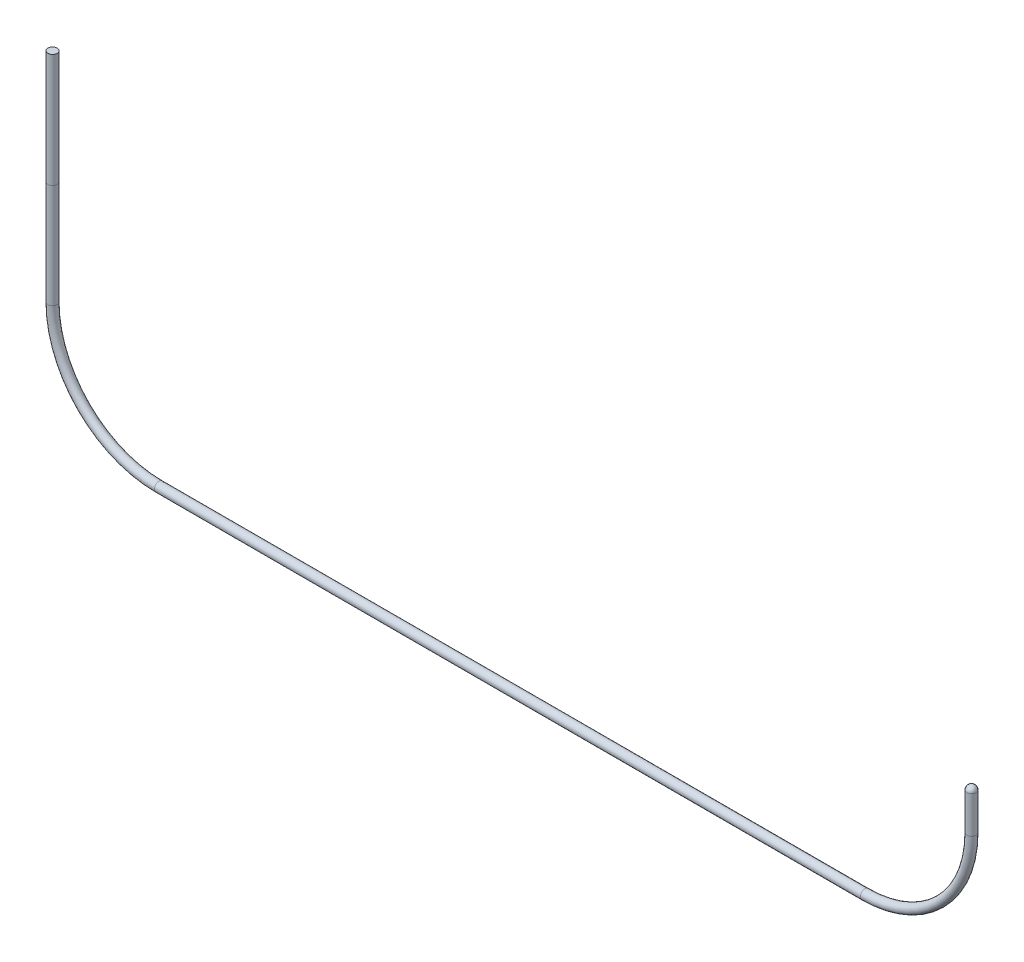
ISO-10303-21;
HEADER;
FILE_DESCRIPTION(('STEP AP214'),'2;1');
FILE_NAME('part.step','',(''),(''),'','','');
FILE_SCHEMA(('AUTOMOTIVE_DESIGN { 1 0 10303 214 1 1 1 1 }'));
ENDSEC;
DATA;
#1=APPLICATION_CONTEXT('core data for automotive mechanical design processes');
#2=APPLICATION_PROTOCOL_DEFINITION('international standard','automotive_design',2000,#1);
#3=PRODUCT_CONTEXT('',#1,'mechanical');
#4=PRODUCT('Part','Part','',(#3));
#5=PRODUCT_RELATED_PRODUCT_CATEGORY('part','',(#4));
#6=PRODUCT_DEFINITION_FORMATION('','',#4);
#7=PRODUCT_DEFINITION_CONTEXT('part definition',#1,'design');
#8=PRODUCT_DEFINITION('design','',#6,#7);
#9=PRODUCT_DEFINITION_SHAPE('','',#8);
#10=(LENGTH_UNIT() NAMED_UNIT(*) SI_UNIT(.MILLI.,.METRE.));
#11=(NAMED_UNIT(*) PLANE_ANGLE_UNIT() SI_UNIT($,.RADIAN.));
#12=(NAMED_UNIT(*) SI_UNIT($,.STERADIAN.) SOLID_ANGLE_UNIT());
#13=UNCERTAINTY_MEASURE_WITH_UNIT(LENGTH_MEASURE(1.E-05),#10,'distance_accuracy_value','');
#14=(GEOMETRIC_REPRESENTATION_CONTEXT(3) GLOBAL_UNCERTAINTY_ASSIGNED_CONTEXT((#13)) GLOBAL_UNIT_ASSIGNED_CONTEXT((#10,
#11,#12)) REPRESENTATION_CONTEXT('',''));
#15=CARTESIAN_POINT('',(0.,0.,0.));
#16=DIRECTION('',(0.,0.,1.));
#17=DIRECTION('',(1.,0.,0.));
#18=AXIS2_PLACEMENT_3D('',#15,#16,#17);
#19=CARTESIAN_POINT('',(-16.4338,-3.4925,0.));
#20=DIRECTION('',(0.,1.,0.));
#21=DIRECTION('',(0.,0.,1.));
#22=AXIS2_PLACEMENT_3D('',#19,#20,#21);
#23=CYLINDRICAL_SURFACE('',#22,0.165100000000001);
#24=CARTESIAN_POINT('',(-16.4338,-3.4925,0.));
#25=DIRECTION('',(0.,1.,0.));
#26=DIRECTION('',(0.,0.,1.));
#27=AXIS2_PLACEMENT_3D('',#24,#25,#26);
#28=CIRCLE('',#27,0.165100000000001);
#29=CARTESIAN_POINT('',(-16.5989,-3.4925,0.));
#30=VERTEX_POINT('',#29);
#31=EDGE_CURVE('E67',#30,#30,#28,.T.);
#32=ORIENTED_EDGE('',*,*,#31,.T.);
#33=EDGE_LOOP('',(#32));
#34=FACE_BOUND('',#33,.T.);
#35=CARTESIAN_POINT('',(-16.4338,0.228599999999995,0.));
#36=DIRECTION('',(0.,1.,0.));
#37=DIRECTION('',(0.,0.,1.));
#38=AXIS2_PLACEMENT_3D('',#35,#36,#37);
#39=CIRCLE('',#38,0.165100000000001);
#40=CARTESIAN_POINT('',(-16.4338,0.228599999999995,0.165100000000001));
#41=VERTEX_POINT('',#40);
#42=EDGE_CURVE('E10',#41,#41,#39,.F.);
#43=ORIENTED_EDGE('',*,*,#42,.T.);
#44=EDGE_LOOP('',(#43));
#45=FACE_BOUND('',#44,.T.);
#46=ADVANCED_FACE('F41',(#34,#45),#23,.T.);
#47=CARTESIAN_POINT('',(16.4338,-3.4925,0.));
#48=DIRECTION('',(0.,1.,0.));
#49=DIRECTION('',(0.,0.,1.));
#50=AXIS2_PLACEMENT_3D('',#47,#48,#49);
#51=CYLINDRICAL_SURFACE('',#50,0.165100000000001);
#52=CARTESIAN_POINT('',(16.4338,-2.1717,0.));
#53=DIRECTION('',(0.,1.,0.));
#54=DIRECTION('',(0.,0.,1.));
#55=AXIS2_PLACEMENT_3D('',#52,#53,#54);
#56=CIRCLE('',#55,0.165100000000001);
#57=CARTESIAN_POINT('',(16.4338,-2.1717,0.165100000000001));
#58=VERTEX_POINT('',#57);
#59=EDGE_CURVE('E49',#58,#58,#56,.F.);
#60=ORIENTED_EDGE('',*,*,#59,.T.);
#61=EDGE_LOOP('',(#60));
#62=FACE_BOUND('',#61,.T.);
#63=CARTESIAN_POINT('',(16.4338,-3.4925,0.));
#64=DIRECTION('',(0.,-1.,0.));
#65=DIRECTION('',(0.,0.,1.));
#66=AXIS2_PLACEMENT_3D('',#63,#64,#65);
#67=CIRCLE('',#66,0.165100000000001);
#68=CARTESIAN_POINT('',(16.5989,-3.4925,0.));
#69=VERTEX_POINT('',#68);
#70=EDGE_CURVE('E55',#69,#69,#67,.T.);
#71=ORIENTED_EDGE('',*,*,#70,.F.);
#72=EDGE_LOOP('',(#71));
#73=FACE_BOUND('',#72,.T.);
#74=ADVANCED_FACE('F91',(#62,#73),#51,.T.);
#75=CARTESIAN_POINT('',(12.6238,-3.4925,0.));
#76=DIRECTION('',(0.,0.,1.));
#77=DIRECTION('',(1.,0.,0.));
#78=AXIS2_PLACEMENT_3D('',#75,#76,#77);
#79=TOROIDAL_SURFACE('',#78,3.81,0.165100000000001);
#80=CARTESIAN_POINT('',(12.6238,-7.3025,0.));
#81=DIRECTION('',(-1.,0.,0.));
#82=DIRECTION('',(0.,0.,1.));
#83=AXIS2_PLACEMENT_3D('',#80,#81,#82);
#84=CIRCLE('',#83,0.165100000000001);
#85=CARTESIAN_POINT('',(12.6238,-7.4676,0.));
#86=VERTEX_POINT('',#85);
#87=EDGE_CURVE('E59',#86,#86,#84,.T.);
#88=CARTESIAN_POINT('',(12.6238,-3.4925,0.));
#89=DIRECTION('',(0.,0.,1.));
#90=DIRECTION('',(1.,0.,0.));
#91=AXIS2_PLACEMENT_3D('',#88,#89,#90);
#92=CIRCLE('',#91,3.9751);
#93=EDGE_CURVE('',#86,#69,#92,.T.);
#94=ORIENTED_EDGE('',*,*,#87,.F.);
#95=ORIENTED_EDGE('',*,*,#70,.T.);
#96=ORIENTED_EDGE('',*,*,#93,.T.);
#97=ORIENTED_EDGE('',*,*,#93,.F.);
#98=EDGE_LOOP('',(#94,#96,#95,#97));
#99=FACE_BOUND('',#98,.T.);
#100=ADVANCED_FACE('F85',(#99),#79,.T.);
#101=CARTESIAN_POINT('',(-12.6238,-7.3025,0.));
#102=DIRECTION('',(1.,0.,0.));
#103=DIRECTION('',(0.,1.,0.));
#104=AXIS2_PLACEMENT_3D('',#101,#102,#103);
#105=CYLINDRICAL_SURFACE('',#104,0.165100000000001);
#106=CARTESIAN_POINT('',(-12.6238,-7.3025,0.));
#107=DIRECTION('',(-1.,0.,0.));
#108=DIRECTION('',(0.,0.,1.));
#109=AXIS2_PLACEMENT_3D('',#106,#107,#108);
#110=CIRCLE('',#109,0.165100000000001);
#111=CARTESIAN_POINT('',(-12.6238,-7.4676,0.));
#112=VERTEX_POINT('',#111);
#113=EDGE_CURVE('E64',#112,#112,#110,.T.);
#114=ORIENTED_EDGE('',*,*,#113,.F.);
#115=EDGE_LOOP('',(#114));
#116=FACE_BOUND('',#115,.T.);
#117=ORIENTED_EDGE('',*,*,#87,.T.);
#118=EDGE_LOOP('',(#117));
#119=FACE_BOUND('',#118,.T.);
#120=ADVANCED_FACE('F79',(#116,#119),#105,.T.);
#121=CARTESIAN_POINT('',(-12.6238,-3.4925,0.));
#122=DIRECTION('',(0.,0.,1.));
#123=DIRECTION('',(1.,0.,0.));
#124=AXIS2_PLACEMENT_3D('',#121,#122,#123);
#125=TOROIDAL_SURFACE('',#124,3.81,0.165100000000001);
#126=CARTESIAN_POINT('',(-12.6238,-3.4925,0.));
#127=DIRECTION('',(0.,0.,1.));
#128=DIRECTION('',(1.,0.,0.));
#129=AXIS2_PLACEMENT_3D('',#126,#127,#128);
#130=CIRCLE('',#129,3.9751);
#131=EDGE_CURVE('',#30,#112,#130,.T.);
#132=ORIENTED_EDGE('',*,*,#31,.F.);
#133=ORIENTED_EDGE('',*,*,#113,.T.);
#134=ORIENTED_EDGE('',*,*,#131,.T.);
#135=ORIENTED_EDGE('',*,*,#131,.F.);
#136=EDGE_LOOP('',(#132,#134,#133,#135));
#137=FACE_BOUND('',#136,.T.);
#138=ADVANCED_FACE('F75',(#137),#125,.T.);
#139=ORIENTED_EDGE('',*,*,#42,.F.);
#140=EDGE_LOOP('',(#139));
#141=FACE_BOUND('',#140,.T.);
#142=CARTESIAN_POINT('',(-16.4338,4.2926,0.));
#143=DIRECTION('',(0.,1.,0.));
#144=DIRECTION('',(0.,0.,1.));
#145=AXIS2_PLACEMENT_3D('',#142,#143,#144);
#146=CIRCLE('',#145,0.165100000000001);
#147=CARTESIAN_POINT('',(-16.4338,4.2926,0.165100000000001));
#148=VERTEX_POINT('',#147);
#149=EDGE_CURVE('E68',#148,#148,#146,.T.);
#150=ORIENTED_EDGE('',*,*,#149,.F.);
#151=EDGE_LOOP('',(#150));
#152=FACE_BOUND('',#151,.T.);
#153=ADVANCED_FACE('F78',(#141,#152),#23,.T.);
#154=CARTESIAN_POINT('',(-16.4338,4.2926,0.));
#155=DIRECTION('',(0.,1.,0.));
#156=DIRECTION('',(0.,0.,1.));
#157=AXIS2_PLACEMENT_3D('',#154,#155,#156);
#158=PLANE('',#157);
#159=ORIENTED_EDGE('',*,*,#149,.T.);
#160=EDGE_LOOP('',(#159));
#161=FACE_BOUND('',#160,.T.);
#162=ADVANCED_FACE('F102',(#161),#158,.T.);
#163=CARTESIAN_POINT('',(16.4338,-2.1717,0.));
#164=DIRECTION('',(0.,0.,1.));
#165=DIRECTION('',(1.,0.,0.));
#166=AXIS2_PLACEMENT_3D('',#163,#164,#165);
#167=SPHERICAL_SURFACE('',#166,0.1651);
#168=CARTESIAN_POINT('',(16.4338,-2.1717,0.));
#169=DIRECTION('',(0.,1.,0.));
#170=DIRECTION('',(0.,0.,1.));
#171=AXIS2_PLACEMENT_3D('',#168,#169,#170);
#172=SPHERICAL_SURFACE('',#171,0.1651);
#173=ORIENTED_EDGE('',*,*,#59,.F.);
#174=EDGE_LOOP('',(#173));
#175=FACE_BOUND('',#174,.T.);
#176=ADVANCED_FACE('F43',(#175),#172,.T.);
#177=CLOSED_SHELL('',(#46,#74,#100,#120,#138,#153,#162,#176));
#178=MANIFOLD_SOLID_BREP('B2',#177);
#179=ADVANCED_BREP_SHAPE_REPRESENTATION('',(#18,#178),#14);
#180=SHAPE_DEFINITION_REPRESENTATION(#9,#179);
ENDSEC;
END-ISO-10303-21;
